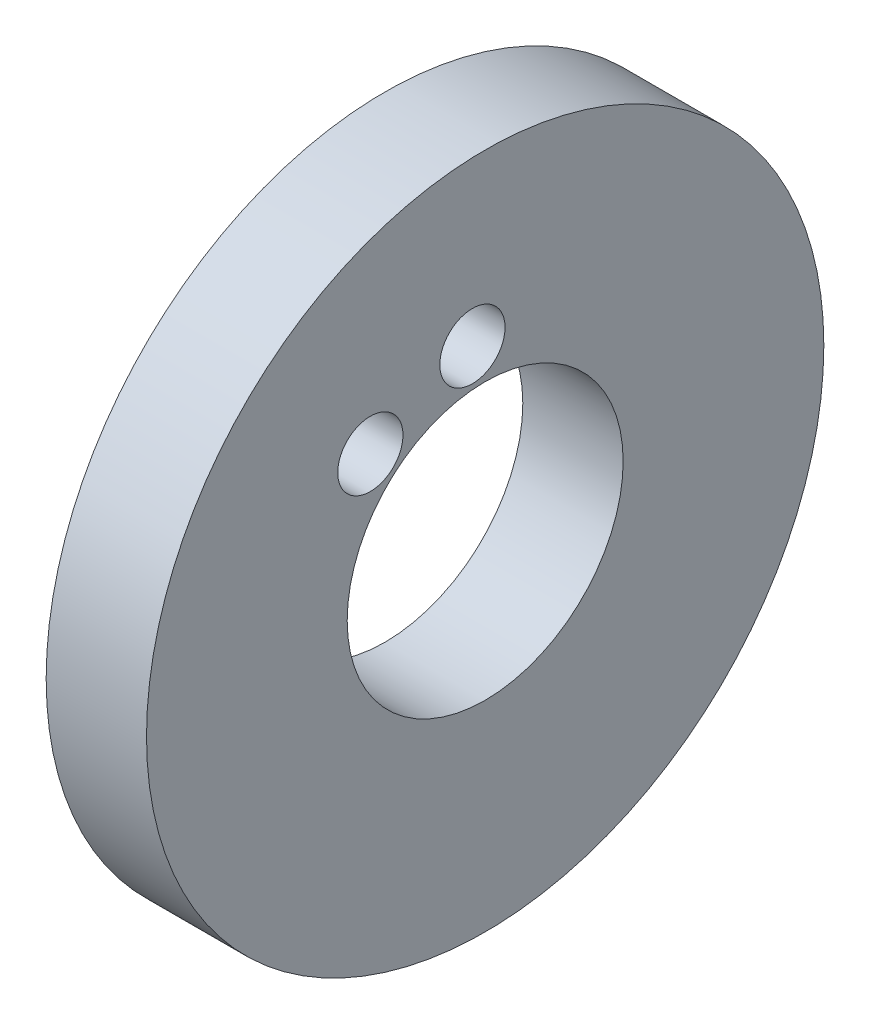
ISO-10303-21;
HEADER;
FILE_DESCRIPTION(('STEP AP214'),'2;1');
FILE_NAME('part.step','',(''),(''),'','','');
FILE_SCHEMA(('AUTOMOTIVE_DESIGN { 1 0 10303 214 1 1 1 1 }'));
ENDSEC;
DATA;
#1=APPLICATION_CONTEXT('core data for automotive mechanical design processes');
#2=APPLICATION_PROTOCOL_DEFINITION('international standard','automotive_design',2000,#1);
#3=PRODUCT_CONTEXT('',#1,'mechanical');
#4=PRODUCT('Part','Part','',(#3));
#5=PRODUCT_RELATED_PRODUCT_CATEGORY('part','',(#4));
#6=PRODUCT_DEFINITION_FORMATION('','',#4);
#7=PRODUCT_DEFINITION_CONTEXT('part definition',#1,'design');
#8=PRODUCT_DEFINITION('design','',#6,#7);
#9=PRODUCT_DEFINITION_SHAPE('','',#8);
#10=(LENGTH_UNIT() NAMED_UNIT(*) SI_UNIT(.MILLI.,.METRE.));
#11=(NAMED_UNIT(*) PLANE_ANGLE_UNIT() SI_UNIT($,.RADIAN.));
#12=(NAMED_UNIT(*) SI_UNIT($,.STERADIAN.) SOLID_ANGLE_UNIT());
#13=UNCERTAINTY_MEASURE_WITH_UNIT(LENGTH_MEASURE(1.E-05),#10,'distance_accuracy_value','');
#14=(GEOMETRIC_REPRESENTATION_CONTEXT(3) GLOBAL_UNCERTAINTY_ASSIGNED_CONTEXT((#13)) GLOBAL_UNIT_ASSIGNED_CONTEXT((#10,
#11,#12)) REPRESENTATION_CONTEXT('',''));
#15=CARTESIAN_POINT('',(0.,0.,0.));
#16=DIRECTION('',(0.,0.,1.));
#17=DIRECTION('',(1.,0.,0.));
#18=AXIS2_PLACEMENT_3D('',#15,#16,#17);
#19=CARTESIAN_POINT('',(135.7,27.,0.));
#20=DIRECTION('',(1.,0.,0.));
#21=DIRECTION('',(0.,0.,-1.));
#22=AXIS2_PLACEMENT_3D('',#19,#20,#21);
#23=PLANE('',#22);
#24=CARTESIAN_POINT('',(135.7,13.9630201959503,1.01689085328036));
#25=DIRECTION('',(1.,0.,0.));
#26=DIRECTION('',(0.,0.,-1.));
#27=AXIS2_PLACEMENT_3D('',#24,#25,#26);
#28=CIRCLE('',#27,2.6);
#29=CARTESIAN_POINT('',(135.7,13.9630201959503,-1.58310914671964));
#30=VERTEX_POINT('',#29);
#31=EDGE_CURVE('E50',#30,#30,#28,.F.);
#32=ORIENTED_EDGE('',*,*,#31,.F.);
#33=EDGE_LOOP('',(#32));
#34=FACE_BOUND('',#33,.T.);
#35=CARTESIAN_POINT('',(135.7,10.5923966844823,9.15429584832002));
#36=DIRECTION('',(1.,0.,0.));
#37=DIRECTION('',(0.,0.,-1.));
#38=AXIS2_PLACEMENT_3D('',#35,#36,#37);
#39=CIRCLE('',#38,2.6);
#40=CARTESIAN_POINT('',(135.7,10.5923966844823,6.55429584832002));
#41=VERTEX_POINT('',#40);
#42=EDGE_CURVE('E53',#41,#41,#39,.F.);
#43=ORIENTED_EDGE('',*,*,#42,.F.);
#44=EDGE_LOOP('',(#43));
#45=FACE_BOUND('',#44,.T.);
#46=CARTESIAN_POINT('',(135.7,0.,0.));
#47=DIRECTION('',(-1.,0.,0.));
#48=DIRECTION('',(0.,0.,1.));
#49=AXIS2_PLACEMENT_3D('',#46,#47,#48);
#50=CIRCLE('',#49,11.);
#51=CARTESIAN_POINT('',(135.7,0.,11.));
#52=VERTEX_POINT('',#51);
#53=EDGE_CURVE('E10',#52,#52,#50,.T.);
#54=ORIENTED_EDGE('',*,*,#53,.F.);
#55=EDGE_LOOP('',(#54));
#56=FACE_BOUND('',#55,.T.);
#57=CARTESIAN_POINT('',(135.7,0.,0.));
#58=DIRECTION('',(-1.,0.,0.));
#59=DIRECTION('',(0.,0.,1.));
#60=AXIS2_PLACEMENT_3D('',#57,#58,#59);
#61=CIRCLE('',#60,27.);
#62=CARTESIAN_POINT('',(135.7,0.,27.));
#63=VERTEX_POINT('',#62);
#64=EDGE_CURVE('E45',#63,#63,#61,.T.);
#65=ORIENTED_EDGE('',*,*,#64,.T.);
#66=EDGE_LOOP('',(#65));
#67=FACE_BOUND('',#66,.T.);
#68=ADVANCED_FACE('F31',(#34,#45,#56,#67),#23,.F.);
#69=CARTESIAN_POINT('',(-110.,0.,0.));
#70=DIRECTION('',(-1.,0.,0.));
#71=DIRECTION('',(0.,0.,1.));
#72=AXIS2_PLACEMENT_3D('',#69,#70,#71);
#73=CYLINDRICAL_SURFACE('',#72,11.);
#74=CARTESIAN_POINT('',(143.7,0.,0.));
#75=DIRECTION('',(-1.,0.,0.));
#76=DIRECTION('',(0.,0.,1.));
#77=AXIS2_PLACEMENT_3D('',#74,#75,#76);
#78=CIRCLE('',#77,11.);
#79=CARTESIAN_POINT('',(143.7,0.,11.));
#80=VERTEX_POINT('',#79);
#81=EDGE_CURVE('E37',#80,#80,#78,.T.);
#82=ORIENTED_EDGE('',*,*,#81,.F.);
#83=EDGE_LOOP('',(#82));
#84=FACE_BOUND('',#83,.T.);
#85=ORIENTED_EDGE('',*,*,#53,.T.);
#86=EDGE_LOOP('',(#85));
#87=FACE_BOUND('',#86,.T.);
#88=ADVANCED_FACE('F70',(#84,#87),#73,.F.);
#89=CARTESIAN_POINT('',(143.7,11.,0.));
#90=DIRECTION('',(-1.,0.,0.));
#91=DIRECTION('',(0.,0.,1.));
#92=AXIS2_PLACEMENT_3D('',#89,#90,#91);
#93=PLANE('',#92);
#94=CARTESIAN_POINT('',(143.7,13.9630201959503,1.01689085328036));
#95=DIRECTION('',(1.,0.,0.));
#96=DIRECTION('',(0.,0.,-1.));
#97=AXIS2_PLACEMENT_3D('',#94,#95,#96);
#98=CIRCLE('',#97,2.6);
#99=CARTESIAN_POINT('',(143.7,13.9630201959503,-1.58310914671964));
#100=VERTEX_POINT('',#99);
#101=EDGE_CURVE('E56',#100,#100,#98,.T.);
#102=ORIENTED_EDGE('',*,*,#101,.F.);
#103=EDGE_LOOP('',(#102));
#104=FACE_BOUND('',#103,.T.);
#105=CARTESIAN_POINT('',(143.7,10.5923966844823,9.15429584832002));
#106=DIRECTION('',(1.,0.,0.));
#107=DIRECTION('',(0.,0.,-1.));
#108=AXIS2_PLACEMENT_3D('',#105,#106,#107);
#109=CIRCLE('',#108,2.6);
#110=CARTESIAN_POINT('',(143.7,10.5923966844823,6.55429584832002));
#111=VERTEX_POINT('',#110);
#112=EDGE_CURVE('E57',#111,#111,#109,.T.);
#113=ORIENTED_EDGE('',*,*,#112,.F.);
#114=EDGE_LOOP('',(#113));
#115=FACE_BOUND('',#114,.T.);
#116=CARTESIAN_POINT('',(143.7,0.,0.));
#117=DIRECTION('',(-1.,0.,0.));
#118=DIRECTION('',(0.,0.,1.));
#119=AXIS2_PLACEMENT_3D('',#116,#117,#118);
#120=CIRCLE('',#119,27.);
#121=CARTESIAN_POINT('',(143.7,0.,27.));
#122=VERTEX_POINT('',#121);
#123=EDGE_CURVE('E41',#122,#122,#120,.T.);
#124=ORIENTED_EDGE('',*,*,#123,.F.);
#125=EDGE_LOOP('',(#124));
#126=FACE_BOUND('',#125,.T.);
#127=ORIENTED_EDGE('',*,*,#81,.T.);
#128=EDGE_LOOP('',(#127));
#129=FACE_BOUND('',#128,.T.);
#130=ADVANCED_FACE('F66',(#104,#115,#126,#129),#93,.F.);
#131=CARTESIAN_POINT('',(-110.,0.,0.));
#132=DIRECTION('',(-1.,0.,0.));
#133=DIRECTION('',(0.,0.,1.));
#134=AXIS2_PLACEMENT_3D('',#131,#132,#133);
#135=CYLINDRICAL_SURFACE('',#134,27.);
#136=ORIENTED_EDGE('',*,*,#64,.F.);
#137=EDGE_LOOP('',(#136));
#138=FACE_BOUND('',#137,.T.);
#139=ORIENTED_EDGE('',*,*,#123,.T.);
#140=EDGE_LOOP('',(#139));
#141=FACE_BOUND('',#140,.T.);
#142=ADVANCED_FACE('F69',(#138,#141),#135,.T.);
#143=CARTESIAN_POINT('',(135.7,10.5923966844823,9.15429584832002));
#144=DIRECTION('',(-1.,0.,0.));
#145=DIRECTION('',(0.,0.,1.));
#146=AXIS2_PLACEMENT_3D('',#143,#144,#145);
#147=CYLINDRICAL_SURFACE('',#146,2.6);
#148=ORIENTED_EDGE('',*,*,#112,.T.);
#149=EDGE_LOOP('',(#148));
#150=FACE_BOUND('',#149,.T.);
#151=ORIENTED_EDGE('',*,*,#42,.T.);
#152=EDGE_LOOP('',(#151));
#153=FACE_BOUND('',#152,.T.);
#154=ADVANCED_FACE('F77',(#150,#153),#147,.F.);
#155=CARTESIAN_POINT('',(135.7,13.9630201959503,1.01689085328036));
#156=DIRECTION('',(-1.,0.,0.));
#157=DIRECTION('',(0.,0.,1.));
#158=AXIS2_PLACEMENT_3D('',#155,#156,#157);
#159=CYLINDRICAL_SURFACE('',#158,2.6);
#160=ORIENTED_EDGE('',*,*,#101,.T.);
#161=EDGE_LOOP('',(#160));
#162=FACE_BOUND('',#161,.T.);
#163=ORIENTED_EDGE('',*,*,#31,.T.);
#164=EDGE_LOOP('',(#163));
#165=FACE_BOUND('',#164,.T.);
#166=ADVANCED_FACE('F63',(#162,#165),#159,.F.);
#167=CLOSED_SHELL('',(#68,#88,#130,#142,#154,#166));
#168=MANIFOLD_SOLID_BREP('B2',#167);
#169=ADVANCED_BREP_SHAPE_REPRESENTATION('',(#18,#168),#14);
#170=SHAPE_DEFINITION_REPRESENTATION(#9,#169);
ENDSEC;
END-ISO-10303-21;
